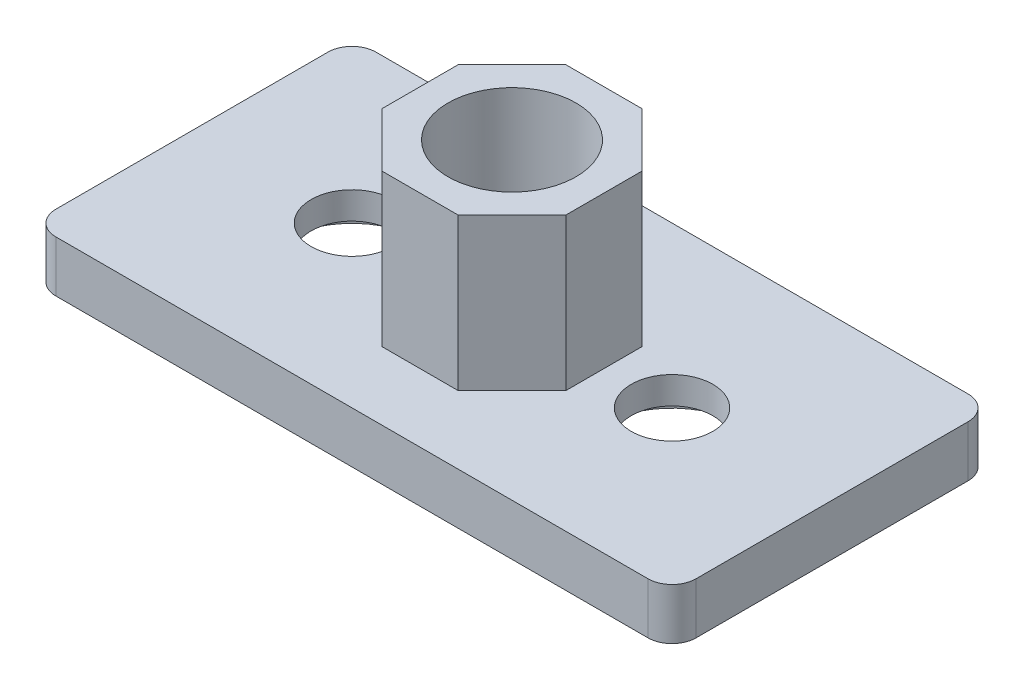
ISO-10303-21;
HEADER;
FILE_DESCRIPTION(('STEP AP214'),'2;1');
FILE_NAME('part.step','',(''),(''),'','','');
FILE_SCHEMA(('AUTOMOTIVE_DESIGN { 1 0 10303 214 1 1 1 1 }'));
ENDSEC;
DATA;
#1=APPLICATION_CONTEXT('core data for automotive mechanical design processes');
#2=APPLICATION_PROTOCOL_DEFINITION('international standard','automotive_design',2000,#1);
#3=PRODUCT_CONTEXT('',#1,'mechanical');
#4=PRODUCT('Part','Part','',(#3));
#5=PRODUCT_RELATED_PRODUCT_CATEGORY('part','',(#4));
#6=PRODUCT_DEFINITION_FORMATION('','',#4);
#7=PRODUCT_DEFINITION_CONTEXT('part definition',#1,'design');
#8=PRODUCT_DEFINITION('design','',#6,#7);
#9=PRODUCT_DEFINITION_SHAPE('','',#8);
#10=(LENGTH_UNIT() NAMED_UNIT(*) SI_UNIT(.MILLI.,.METRE.));
#11=(NAMED_UNIT(*) PLANE_ANGLE_UNIT() SI_UNIT($,.RADIAN.));
#12=(NAMED_UNIT(*) SI_UNIT($,.STERADIAN.) SOLID_ANGLE_UNIT());
#13=UNCERTAINTY_MEASURE_WITH_UNIT(LENGTH_MEASURE(1.E-05),#10,'distance_accuracy_value','');
#14=(GEOMETRIC_REPRESENTATION_CONTEXT(3) GLOBAL_UNCERTAINTY_ASSIGNED_CONTEXT((#13)) GLOBAL_UNIT_ASSIGNED_CONTEXT((#10,
#11,#12)) REPRESENTATION_CONTEXT('',''));
#15=CARTESIAN_POINT('',(0.,0.,0.));
#16=DIRECTION('',(0.,0.,1.));
#17=DIRECTION('',(1.,0.,0.));
#18=AXIS2_PLACEMENT_3D('',#15,#16,#17);
#19=CARTESIAN_POINT('',(0.,1.6,0.));
#20=DIRECTION('',(0.,-1.,0.));
#21=DIRECTION('',(1.,0.,0.));
#22=AXIS2_PLACEMENT_3D('',#19,#20,#21);
#23=PLANE('',#22);
#24=CARTESIAN_POINT('',(-10.,1.6,10.));
#25=DIRECTION('',(0.,-1.,0.));
#26=DIRECTION('',(1.,0.,0.));
#27=AXIS2_PLACEMENT_3D('',#24,#25,#26);
#28=CIRCLE('',#27,2.55000000000001);
#29=CARTESIAN_POINT('',(-7.44999999999999,1.6,10.));
#30=VERTEX_POINT('',#29);
#31=EDGE_CURVE('E205',#30,#30,#28,.T.);
#32=ORIENTED_EDGE('',*,*,#31,.T.);
#33=EDGE_LOOP('',(#32));
#34=FACE_BOUND('',#33,.T.);
#35=CARTESIAN_POINT('',(10.,1.6,10.));
#36=DIRECTION('',(0.,-1.,0.));
#37=DIRECTION('',(1.,0.,0.));
#38=AXIS2_PLACEMENT_3D('',#35,#36,#37);
#39=CIRCLE('',#38,2.55000000000001);
#40=CARTESIAN_POINT('',(12.55,1.6,10.));
#41=VERTEX_POINT('',#40);
#42=EDGE_CURVE('E200',#41,#41,#39,.T.);
#43=ORIENTED_EDGE('',*,*,#42,.T.);
#44=EDGE_LOOP('',(#43));
#45=FACE_BOUND('',#44,.T.);
#46=DIRECTION('',(0.,0.,1.));
#47=VECTOR('',#46,1.);
#48=CARTESIAN_POINT('',(20.,1.6,0.));
#49=LINE('',#48,#47);
#50=CARTESIAN_POINT('',(20.,1.6,1.5));
#51=VERTEX_POINT('',#50);
#52=CARTESIAN_POINT('',(20.,1.6,18.5));
#53=VERTEX_POINT('',#52);
#54=EDGE_CURVE('E187',#51,#53,#49,.T.);
#55=ORIENTED_EDGE('',*,*,#54,.F.);
#56=CARTESIAN_POINT('',(18.5,1.6,1.5));
#57=DIRECTION('',(0.,-1.,0.));
#58=DIRECTION('',(1.,0.,0.));
#59=AXIS2_PLACEMENT_3D('',#56,#57,#58);
#60=CIRCLE('',#59,1.5);
#61=CARTESIAN_POINT('',(18.5,1.6,0.));
#62=VERTEX_POINT('',#61);
#63=EDGE_CURVE('E232',#51,#62,#60,.F.);
#64=ORIENTED_EDGE('',*,*,#63,.T.);
#65=DIRECTION('',(1.,0.,0.));
#66=VECTOR('',#65,1.);
#67=CARTESIAN_POINT('',(-20.,1.6,0.));
#68=LINE('',#67,#66);
#69=CARTESIAN_POINT('',(-18.5,1.6,0.));
#70=VERTEX_POINT('',#69);
#71=EDGE_CURVE('E183',#70,#62,#68,.T.);
#72=ORIENTED_EDGE('',*,*,#71,.F.);
#73=CARTESIAN_POINT('',(-18.5,1.6,1.5));
#74=DIRECTION('',(0.,-1.,0.));
#75=DIRECTION('',(1.,0.,0.));
#76=AXIS2_PLACEMENT_3D('',#73,#74,#75);
#77=CIRCLE('',#76,1.5);
#78=CARTESIAN_POINT('',(-20.,1.6,1.5));
#79=VERTEX_POINT('',#78);
#80=EDGE_CURVE('E230',#70,#79,#77,.F.);
#81=ORIENTED_EDGE('',*,*,#80,.T.);
#82=DIRECTION('',(0.,0.,-1.));
#83=VECTOR('',#82,1.);
#84=CARTESIAN_POINT('',(-20.,1.6,20.));
#85=LINE('',#84,#83);
#86=CARTESIAN_POINT('',(-20.,1.6,18.5));
#87=VERTEX_POINT('',#86);
#88=EDGE_CURVE('E180',#87,#79,#85,.T.);
#89=ORIENTED_EDGE('',*,*,#88,.F.);
#90=CARTESIAN_POINT('',(-18.5,1.6,18.5));
#91=DIRECTION('',(0.,-1.,0.));
#92=DIRECTION('',(1.,0.,0.));
#93=AXIS2_PLACEMENT_3D('',#90,#91,#92);
#94=CIRCLE('',#93,1.5);
#95=CARTESIAN_POINT('',(-18.5,1.6,20.));
#96=VERTEX_POINT('',#95);
#97=EDGE_CURVE('E48',#87,#96,#94,.F.);
#98=ORIENTED_EDGE('',*,*,#97,.T.);
#99=DIRECTION('',(-1.,0.,0.));
#100=VECTOR('',#99,1.);
#101=CARTESIAN_POINT('',(20.,1.6,20.));
#102=LINE('',#101,#100);
#103=CARTESIAN_POINT('',(18.5,1.6,20.));
#104=VERTEX_POINT('',#103);
#105=EDGE_CURVE('E190',#104,#96,#102,.T.);
#106=ORIENTED_EDGE('',*,*,#105,.F.);
#107=CARTESIAN_POINT('',(18.5,1.6,18.5));
#108=DIRECTION('',(0.,-1.,0.));
#109=DIRECTION('',(1.,0.,0.));
#110=AXIS2_PLACEMENT_3D('',#107,#108,#109);
#111=CIRCLE('',#110,1.5);
#112=EDGE_CURVE('E228',#104,#53,#111,.F.);
#113=ORIENTED_EDGE('',*,*,#112,.T.);
#114=EDGE_LOOP('',(#55,#64,#72,#81,#89,#98,#106,#113));
#115=FACE_BOUND('',#114,.T.);
#116=DIRECTION('',(0.,0.,-1.));
#117=VECTOR('',#116,1.);
#118=CARTESIAN_POINT('',(5.75,1.6,7.6182720163547));
#119=LINE('',#118,#117);
#120=CARTESIAN_POINT('',(5.75,1.6,12.3817279836453));
#121=VERTEX_POINT('',#120);
#122=CARTESIAN_POINT('',(5.75,1.6,7.6182720163547));
#123=VERTEX_POINT('',#122);
#124=EDGE_CURVE('E170',#121,#123,#119,.T.);
#125=ORIENTED_EDGE('',*,*,#124,.F.);
#126=DIRECTION('',(0.707106781186547,0.,-0.707106781186548));
#127=VECTOR('',#126,1.);
#128=CARTESIAN_POINT('',(5.75,1.6,12.3817279836453));
#129=LINE('',#128,#127);
#130=CARTESIAN_POINT('',(2.3817279836453,1.6,15.75));
#131=VERTEX_POINT('',#130);
#132=EDGE_CURVE('E167',#131,#121,#129,.T.);
#133=ORIENTED_EDGE('',*,*,#132,.F.);
#134=DIRECTION('',(1.,0.,0.));
#135=VECTOR('',#134,1.);
#136=CARTESIAN_POINT('',(2.38172798364531,1.6,15.75));
#137=LINE('',#136,#135);
#138=CARTESIAN_POINT('',(-2.38172798364529,1.6,15.75));
#139=VERTEX_POINT('',#138);
#140=EDGE_CURVE('E535',#139,#131,#137,.T.);
#141=ORIENTED_EDGE('',*,*,#140,.F.);
#142=DIRECTION('',(0.707106781186548,0.,0.707106781186547));
#143=VECTOR('',#142,1.);
#144=CARTESIAN_POINT('',(-2.38172798364529,1.6,15.75));
#145=LINE('',#144,#143);
#146=CARTESIAN_POINT('',(-5.75,1.6,12.3817279836453));
#147=VERTEX_POINT('',#146);
#148=EDGE_CURVE('E538',#147,#139,#145,.T.);
#149=ORIENTED_EDGE('',*,*,#148,.F.);
#150=DIRECTION('',(0.,0.,1.));
#151=VECTOR('',#150,1.);
#152=CARTESIAN_POINT('',(-5.75,1.6,12.3817279836453));
#153=LINE('',#152,#151);
#154=CARTESIAN_POINT('',(-5.75,1.6,7.61827201635471));
#155=VERTEX_POINT('',#154);
#156=EDGE_CURVE('E541',#155,#147,#153,.T.);
#157=ORIENTED_EDGE('',*,*,#156,.F.);
#158=DIRECTION('',(-0.707106781186547,0.,0.707106781186548));
#159=VECTOR('',#158,1.);
#160=CARTESIAN_POINT('',(-5.75,1.6,7.61827201635471));
#161=LINE('',#160,#159);
#162=CARTESIAN_POINT('',(-2.3817279836453,1.6,4.25));
#163=VERTEX_POINT('',#162);
#164=EDGE_CURVE('E512',#163,#155,#161,.T.);
#165=ORIENTED_EDGE('',*,*,#164,.F.);
#166=DIRECTION('',(-1.,0.,0.));
#167=VECTOR('',#166,1.);
#168=CARTESIAN_POINT('',(-2.3817279836453,1.6,4.25));
#169=LINE('',#168,#167);
#170=CARTESIAN_POINT('',(2.3817279836453,1.6,4.25));
#171=VERTEX_POINT('',#170);
#172=EDGE_CURVE('E509',#171,#163,#169,.T.);
#173=ORIENTED_EDGE('',*,*,#172,.F.);
#174=DIRECTION('',(-0.707106781186547,0.,-0.707106781186548));
#175=VECTOR('',#174,1.);
#176=CARTESIAN_POINT('',(2.3817279836453,1.6,4.25));
#177=LINE('',#176,#175);
#178=EDGE_CURVE('E513',#123,#171,#177,.T.);
#179=ORIENTED_EDGE('',*,*,#178,.F.);
#180=EDGE_LOOP('',(#125,#133,#141,#149,#157,#165,#173,#179));
#181=FACE_BOUND('',#180,.T.);
#182=ADVANCED_FACE('F33',(#34,#45,#115,#181),#23,.F.);
#183=CARTESIAN_POINT('',(-20.,1.6,20.));
#184=DIRECTION('',(-1.,0.,0.));
#185=DIRECTION('',(0.,-1.,0.));
#186=AXIS2_PLACEMENT_3D('',#183,#184,#185);
#187=PLANE('',#186);
#188=ORIENTED_EDGE('',*,*,#88,.T.);
#189=DIRECTION('',(0.,-1.,0.));
#190=VECTOR('',#189,1.);
#191=CARTESIAN_POINT('',(-20.,1.6,1.5));
#192=LINE('',#191,#190);
#193=CARTESIAN_POINT('',(-20.,-1.6,1.5));
#194=VERTEX_POINT('',#193);
#195=EDGE_CURVE('E236',#79,#194,#192,.T.);
#196=ORIENTED_EDGE('',*,*,#195,.T.);
#197=DIRECTION('',(0.,0.,-1.));
#198=VECTOR('',#197,1.);
#199=CARTESIAN_POINT('',(-20.,-1.6,20.));
#200=LINE('',#199,#198);
#201=CARTESIAN_POINT('',(-20.,-1.6,18.5));
#202=VERTEX_POINT('',#201);
#203=EDGE_CURVE('E171',#202,#194,#200,.T.);
#204=ORIENTED_EDGE('',*,*,#203,.F.);
#205=DIRECTION('',(0.,-1.,0.));
#206=VECTOR('',#205,1.);
#207=CARTESIAN_POINT('',(-20.,1.6,18.5));
#208=LINE('',#207,#206);
#209=EDGE_CURVE('E234',#202,#87,#208,.F.);
#210=ORIENTED_EDGE('',*,*,#209,.T.);
#211=EDGE_LOOP('',(#188,#196,#204,#210));
#212=FACE_BOUND('',#211,.T.);
#213=ADVANCED_FACE('F269',(#212),#187,.T.);
#214=CARTESIAN_POINT('',(20.,1.6,20.));
#215=DIRECTION('',(0.,0.,1.));
#216=DIRECTION('',(1.,0.,0.));
#217=AXIS2_PLACEMENT_3D('',#214,#215,#216);
#218=PLANE('',#217);
#219=DIRECTION('',(-1.,0.,0.));
#220=VECTOR('',#219,1.);
#221=CARTESIAN_POINT('',(20.,-1.6,20.));
#222=LINE('',#221,#220);
#223=CARTESIAN_POINT('',(18.5,-1.6,20.));
#224=VERTEX_POINT('',#223);
#225=CARTESIAN_POINT('',(-18.5,-1.6,20.));
#226=VERTEX_POINT('',#225);
#227=EDGE_CURVE('E184',#224,#226,#222,.T.);
#228=ORIENTED_EDGE('',*,*,#227,.F.);
#229=DIRECTION('',(0.,-1.,0.));
#230=VECTOR('',#229,1.);
#231=CARTESIAN_POINT('',(18.5,1.6,20.));
#232=LINE('',#231,#230);
#233=EDGE_CURVE('E11',#224,#104,#232,.F.);
#234=ORIENTED_EDGE('',*,*,#233,.T.);
#235=ORIENTED_EDGE('',*,*,#105,.T.);
#236=DIRECTION('',(0.,-1.,0.));
#237=VECTOR('',#236,1.);
#238=CARTESIAN_POINT('',(-18.5,1.6,20.));
#239=LINE('',#238,#237);
#240=EDGE_CURVE('E41',#96,#226,#239,.T.);
#241=ORIENTED_EDGE('',*,*,#240,.T.);
#242=EDGE_LOOP('',(#228,#234,#235,#241));
#243=FACE_BOUND('',#242,.T.);
#244=ADVANCED_FACE('F240',(#243),#218,.T.);
#245=CARTESIAN_POINT('',(20.,1.6,0.));
#246=DIRECTION('',(1.,0.,0.));
#247=DIRECTION('',(0.,1.,0.));
#248=AXIS2_PLACEMENT_3D('',#245,#246,#247);
#249=PLANE('',#248);
#250=DIRECTION('',(0.,0.,1.));
#251=VECTOR('',#250,1.);
#252=CARTESIAN_POINT('',(20.,-1.6,0.));
#253=LINE('',#252,#251);
#254=CARTESIAN_POINT('',(20.,-1.6,1.5));
#255=VERTEX_POINT('',#254);
#256=CARTESIAN_POINT('',(20.,-1.6,18.5));
#257=VERTEX_POINT('',#256);
#258=EDGE_CURVE('E195',#255,#257,#253,.T.);
#259=ORIENTED_EDGE('',*,*,#258,.F.);
#260=DIRECTION('',(0.,-1.,0.));
#261=VECTOR('',#260,1.);
#262=CARTESIAN_POINT('',(20.,1.6,1.5));
#263=LINE('',#262,#261);
#264=EDGE_CURVE('E225',#255,#51,#263,.F.);
#265=ORIENTED_EDGE('',*,*,#264,.T.);
#266=ORIENTED_EDGE('',*,*,#54,.T.);
#267=DIRECTION('',(0.,-1.,0.));
#268=VECTOR('',#267,1.);
#269=CARTESIAN_POINT('',(20.,1.6,18.5));
#270=LINE('',#269,#268);
#271=EDGE_CURVE('E222',#53,#257,#270,.T.);
#272=ORIENTED_EDGE('',*,*,#271,.T.);
#273=EDGE_LOOP('',(#259,#265,#266,#272));
#274=FACE_BOUND('',#273,.T.);
#275=ADVANCED_FACE('F251',(#274),#249,.T.);
#276=CARTESIAN_POINT('',(-20.,1.6,0.));
#277=DIRECTION('',(0.,0.,-1.));
#278=DIRECTION('',(-1.,0.,0.));
#279=AXIS2_PLACEMENT_3D('',#276,#277,#278);
#280=PLANE('',#279);
#281=ORIENTED_EDGE('',*,*,#71,.T.);
#282=DIRECTION('',(0.,-1.,0.));
#283=VECTOR('',#282,1.);
#284=CARTESIAN_POINT('',(18.5,1.6,0.));
#285=LINE('',#284,#283);
#286=CARTESIAN_POINT('',(18.5,-1.6,0.));
#287=VERTEX_POINT('',#286);
#288=EDGE_CURVE('E211',#62,#287,#285,.T.);
#289=ORIENTED_EDGE('',*,*,#288,.T.);
#290=DIRECTION('',(1.,0.,0.));
#291=VECTOR('',#290,1.);
#292=CARTESIAN_POINT('',(-20.,-1.6,0.));
#293=LINE('',#292,#291);
#294=CARTESIAN_POINT('',(-18.5,-1.6,0.));
#295=VERTEX_POINT('',#294);
#296=EDGE_CURVE('E174',#295,#287,#293,.T.);
#297=ORIENTED_EDGE('',*,*,#296,.F.);
#298=DIRECTION('',(0.,-1.,0.));
#299=VECTOR('',#298,1.);
#300=CARTESIAN_POINT('',(-18.5,1.6,0.));
#301=LINE('',#300,#299);
#302=EDGE_CURVE('E191',#295,#70,#301,.F.);
#303=ORIENTED_EDGE('',*,*,#302,.T.);
#304=EDGE_LOOP('',(#281,#289,#297,#303));
#305=FACE_BOUND('',#304,.T.);
#306=ADVANCED_FACE('F262',(#305),#280,.T.);
#307=CARTESIAN_POINT('',(0.,-1.6,0.));
#308=DIRECTION('',(0.,-1.,0.));
#309=DIRECTION('',(1.,0.,0.));
#310=AXIS2_PLACEMENT_3D('',#307,#308,#309);
#311=PLANE('',#310);
#312=CARTESIAN_POINT('',(-10.,-1.6,10.));
#313=DIRECTION('',(0.,-1.,0.));
#314=DIRECTION('',(0.,0.,-1.));
#315=AXIS2_PLACEMENT_3D('',#312,#313,#314);
#316=CIRCLE('',#315,4.50000000000001);
#317=CARTESIAN_POINT('',(-10.,-1.6,5.49999999999999));
#318=VERTEX_POINT('',#317);
#319=EDGE_CURVE('E573',#318,#318,#316,.T.);
#320=ORIENTED_EDGE('',*,*,#319,.F.);
#321=EDGE_LOOP('',(#320));
#322=FACE_BOUND('',#321,.T.);
#323=CARTESIAN_POINT('',(10.,-1.6,10.));
#324=DIRECTION('',(0.,-1.,0.));
#325=DIRECTION('',(0.,0.,-1.));
#326=AXIS2_PLACEMENT_3D('',#323,#324,#325);
#327=CIRCLE('',#326,4.50000000000001);
#328=CARTESIAN_POINT('',(10.,-1.6,5.49999999999999));
#329=VERTEX_POINT('',#328);
#330=EDGE_CURVE('E208',#329,#329,#327,.T.);
#331=ORIENTED_EDGE('',*,*,#330,.F.);
#332=EDGE_LOOP('',(#331));
#333=FACE_BOUND('',#332,.T.);
#334=CARTESIAN_POINT('',(0.,-1.6,10.));
#335=DIRECTION('',(0.,-1.,0.));
#336=DIRECTION('',(0.,0.,-1.));
#337=AXIS2_PLACEMENT_3D('',#334,#335,#336);
#338=CIRCLE('',#337,3.99999999999999);
#339=CARTESIAN_POINT('',(0.,-1.6,6.00000000000001));
#340=VERTEX_POINT('',#339);
#341=EDGE_CURVE('E203',#340,#340,#338,.T.);
#342=ORIENTED_EDGE('',*,*,#341,.F.);
#343=EDGE_LOOP('',(#342));
#344=FACE_BOUND('',#343,.T.);
#345=ORIENTED_EDGE('',*,*,#296,.T.);
#346=CARTESIAN_POINT('',(18.5,-1.6,1.5));
#347=DIRECTION('',(0.,-1.,0.));
#348=DIRECTION('',(1.,0.,0.));
#349=AXIS2_PLACEMENT_3D('',#346,#347,#348);
#350=CIRCLE('',#349,1.5);
#351=EDGE_CURVE('E220',#287,#255,#350,.T.);
#352=ORIENTED_EDGE('',*,*,#351,.T.);
#353=ORIENTED_EDGE('',*,*,#258,.T.);
#354=CARTESIAN_POINT('',(18.5,-1.6,18.5));
#355=DIRECTION('',(0.,-1.,0.));
#356=DIRECTION('',(1.,0.,0.));
#357=AXIS2_PLACEMENT_3D('',#354,#355,#356);
#358=CIRCLE('',#357,1.5);
#359=EDGE_CURVE('E216',#257,#224,#358,.T.);
#360=ORIENTED_EDGE('',*,*,#359,.T.);
#361=ORIENTED_EDGE('',*,*,#227,.T.);
#362=CARTESIAN_POINT('',(-18.5,-1.6,18.5));
#363=DIRECTION('',(0.,-1.,0.));
#364=DIRECTION('',(1.,0.,0.));
#365=AXIS2_PLACEMENT_3D('',#362,#363,#364);
#366=CIRCLE('',#365,1.5);
#367=EDGE_CURVE('E214',#226,#202,#366,.T.);
#368=ORIENTED_EDGE('',*,*,#367,.T.);
#369=ORIENTED_EDGE('',*,*,#203,.T.);
#370=CARTESIAN_POINT('',(-18.5,-1.6,1.5));
#371=DIRECTION('',(0.,-1.,0.));
#372=DIRECTION('',(1.,0.,0.));
#373=AXIS2_PLACEMENT_3D('',#370,#371,#372);
#374=CIRCLE('',#373,1.5);
#375=EDGE_CURVE('E218',#194,#295,#374,.T.);
#376=ORIENTED_EDGE('',*,*,#375,.T.);
#377=EDGE_LOOP('',(#345,#352,#353,#360,#361,#368,#369,#376));
#378=FACE_BOUND('',#377,.T.);
#379=ADVANCED_FACE('F243',(#322,#333,#344,#378),#311,.T.);
#380=CARTESIAN_POINT('',(5.75,11.1,7.6182720163547));
#381=DIRECTION('',(-1.,0.,0.));
#382=DIRECTION('',(0.,-1.,0.));
#383=AXIS2_PLACEMENT_3D('',#380,#381,#382);
#384=PLANE('',#383);
#385=ORIENTED_EDGE('',*,*,#124,.T.);
#386=DIRECTION('',(0.,-1.,0.));
#387=VECTOR('',#386,1.);
#388=CARTESIAN_POINT('',(5.75,11.1,7.6182720163547));
#389=LINE('',#388,#387);
#390=CARTESIAN_POINT('',(5.75,11.1,7.6182720163547));
#391=VERTEX_POINT('',#390);
#392=EDGE_CURVE('E151',#391,#123,#389,.T.);
#393=ORIENTED_EDGE('',*,*,#392,.F.);
#394=DIRECTION('',(0.,0.,-1.));
#395=VECTOR('',#394,1.);
#396=CARTESIAN_POINT('',(5.75,11.1,7.6182720163547));
#397=LINE('',#396,#395);
#398=CARTESIAN_POINT('',(5.75,11.1,12.3817279836453));
#399=VERTEX_POINT('',#398);
#400=EDGE_CURVE('E158',#399,#391,#397,.T.);
#401=ORIENTED_EDGE('',*,*,#400,.F.);
#402=DIRECTION('',(0.,-1.,0.));
#403=VECTOR('',#402,1.);
#404=CARTESIAN_POINT('',(5.75,11.1,12.3817279836453));
#405=LINE('',#404,#403);
#406=EDGE_CURVE('E531',#399,#121,#405,.T.);
#407=ORIENTED_EDGE('',*,*,#406,.T.);
#408=EDGE_LOOP('',(#385,#393,#401,#407));
#409=FACE_BOUND('',#408,.T.);
#410=ADVANCED_FACE('F169',(#409),#384,.F.);
#411=CARTESIAN_POINT('',(2.3817279836453,11.1,4.25));
#412=DIRECTION('',(-0.707106781186548,0.,0.707106781186547));
#413=DIRECTION('',(0.707106781186547,0.,0.707106781186548));
#414=AXIS2_PLACEMENT_3D('',#411,#412,#413);
#415=PLANE('',#414);
#416=ORIENTED_EDGE('',*,*,#178,.T.);
#417=DIRECTION('',(0.,-1.,0.));
#418=VECTOR('',#417,1.);
#419=CARTESIAN_POINT('',(2.3817279836453,11.1,4.25));
#420=LINE('',#419,#418);
#421=CARTESIAN_POINT('',(2.3817279836453,11.1,4.25));
#422=VERTEX_POINT('',#421);
#423=EDGE_CURVE('E154',#422,#171,#420,.T.);
#424=ORIENTED_EDGE('',*,*,#423,.F.);
#425=DIRECTION('',(-0.707106781186547,0.,-0.707106781186548));
#426=VECTOR('',#425,1.);
#427=CARTESIAN_POINT('',(2.3817279836453,11.1,4.25));
#428=LINE('',#427,#426);
#429=EDGE_CURVE('E146',#391,#422,#428,.T.);
#430=ORIENTED_EDGE('',*,*,#429,.F.);
#431=ORIENTED_EDGE('',*,*,#392,.T.);
#432=EDGE_LOOP('',(#416,#424,#430,#431));
#433=FACE_BOUND('',#432,.T.);
#434=ADVANCED_FACE('F149',(#433),#415,.F.);
#435=CARTESIAN_POINT('',(-2.3817279836453,11.1,4.25));
#436=DIRECTION('',(0.,0.,1.));
#437=DIRECTION('',(1.,0.,0.));
#438=AXIS2_PLACEMENT_3D('',#435,#436,#437);
#439=PLANE('',#438);
#440=ORIENTED_EDGE('',*,*,#172,.T.);
#441=DIRECTION('',(0.,-1.,0.));
#442=VECTOR('',#441,1.);
#443=CARTESIAN_POINT('',(-2.3817279836453,11.1,4.25));
#444=LINE('',#443,#442);
#445=CARTESIAN_POINT('',(-2.3817279836453,11.1,4.25));
#446=VERTEX_POINT('',#445);
#447=EDGE_CURVE('E176',#446,#163,#444,.T.);
#448=ORIENTED_EDGE('',*,*,#447,.F.);
#449=DIRECTION('',(-1.,0.,0.));
#450=VECTOR('',#449,1.);
#451=CARTESIAN_POINT('',(-2.3817279836453,11.1,4.25));
#452=LINE('',#451,#450);
#453=EDGE_CURVE('E157',#422,#446,#452,.T.);
#454=ORIENTED_EDGE('',*,*,#453,.F.);
#455=ORIENTED_EDGE('',*,*,#423,.T.);
#456=EDGE_LOOP('',(#440,#448,#454,#455));
#457=FACE_BOUND('',#456,.T.);
#458=ADVANCED_FACE('F435',(#457),#439,.F.);
#459=CARTESIAN_POINT('',(-5.75,11.1,7.61827201635471));
#460=DIRECTION('',(0.707106781186548,0.,0.707106781186547));
#461=DIRECTION('',(0.707106781186547,0.,-0.707106781186548));
#462=AXIS2_PLACEMENT_3D('',#459,#460,#461);
#463=PLANE('',#462);
#464=ORIENTED_EDGE('',*,*,#164,.T.);
#465=DIRECTION('',(0.,-1.,0.));
#466=VECTOR('',#465,1.);
#467=CARTESIAN_POINT('',(-5.75,11.1,7.61827201635471));
#468=LINE('',#467,#466);
#469=CARTESIAN_POINT('',(-5.75,11.1,7.61827201635471));
#470=VERTEX_POINT('',#469);
#471=EDGE_CURVE('E519',#470,#155,#468,.T.);
#472=ORIENTED_EDGE('',*,*,#471,.F.);
#473=DIRECTION('',(-0.707106781186547,0.,0.707106781186548));
#474=VECTOR('',#473,1.);
#475=CARTESIAN_POINT('',(-5.75,11.1,7.61827201635471));
#476=LINE('',#475,#474);
#477=EDGE_CURVE('E518',#446,#470,#476,.T.);
#478=ORIENTED_EDGE('',*,*,#477,.F.);
#479=ORIENTED_EDGE('',*,*,#447,.T.);
#480=EDGE_LOOP('',(#464,#472,#478,#479));
#481=FACE_BOUND('',#480,.T.);
#482=ADVANCED_FACE('F426',(#481),#463,.F.);
#483=CARTESIAN_POINT('',(-5.75,11.1,12.3817279836453));
#484=DIRECTION('',(1.,0.,0.));
#485=DIRECTION('',(0.,0.,-1.));
#486=AXIS2_PLACEMENT_3D('',#483,#484,#485);
#487=PLANE('',#486);
#488=ORIENTED_EDGE('',*,*,#156,.T.);
#489=DIRECTION('',(0.,-1.,0.));
#490=VECTOR('',#489,1.);
#491=CARTESIAN_POINT('',(-5.75,11.1,12.3817279836453));
#492=LINE('',#491,#490);
#493=CARTESIAN_POINT('',(-5.75,11.1,12.3817279836453));
#494=VERTEX_POINT('',#493);
#495=EDGE_CURVE('E520',#494,#147,#492,.T.);
#496=ORIENTED_EDGE('',*,*,#495,.F.);
#497=DIRECTION('',(0.,0.,1.));
#498=VECTOR('',#497,1.);
#499=CARTESIAN_POINT('',(-5.75,11.1,12.3817279836453));
#500=LINE('',#499,#498);
#501=EDGE_CURVE('E553',#470,#494,#500,.T.);
#502=ORIENTED_EDGE('',*,*,#501,.F.);
#503=ORIENTED_EDGE('',*,*,#471,.T.);
#504=EDGE_LOOP('',(#488,#496,#502,#503));
#505=FACE_BOUND('',#504,.T.);
#506=ADVANCED_FACE('F417',(#505),#487,.F.);
#507=CARTESIAN_POINT('',(-2.38172798364529,11.1,15.75));
#508=DIRECTION('',(0.707106781186547,0.,-0.707106781186548));
#509=DIRECTION('',(-0.707106781186548,0.,-0.707106781186547));
#510=AXIS2_PLACEMENT_3D('',#507,#508,#509);
#511=PLANE('',#510);
#512=ORIENTED_EDGE('',*,*,#148,.T.);
#513=DIRECTION('',(0.,-1.,0.));
#514=VECTOR('',#513,1.);
#515=CARTESIAN_POINT('',(-2.38172798364529,11.1,15.75));
#516=LINE('',#515,#514);
#517=CARTESIAN_POINT('',(-2.38172798364529,11.1,15.75));
#518=VERTEX_POINT('',#517);
#519=EDGE_CURVE('E525',#518,#139,#516,.T.);
#520=ORIENTED_EDGE('',*,*,#519,.F.);
#521=DIRECTION('',(0.707106781186548,0.,0.707106781186547));
#522=VECTOR('',#521,1.);
#523=CARTESIAN_POINT('',(-2.38172798364529,11.1,15.75));
#524=LINE('',#523,#522);
#525=EDGE_CURVE('E551',#494,#518,#524,.T.);
#526=ORIENTED_EDGE('',*,*,#525,.F.);
#527=ORIENTED_EDGE('',*,*,#495,.T.);
#528=EDGE_LOOP('',(#512,#520,#526,#527));
#529=FACE_BOUND('',#528,.T.);
#530=ADVANCED_FACE('F408',(#529),#511,.F.);
#531=CARTESIAN_POINT('',(2.3817279836453,11.1,15.75));
#532=DIRECTION('',(0.,0.,-1.));
#533=DIRECTION('',(-1.,0.,0.));
#534=AXIS2_PLACEMENT_3D('',#531,#532,#533);
#535=PLANE('',#534);
#536=ORIENTED_EDGE('',*,*,#140,.T.);
#537=DIRECTION('',(0.,-1.,0.));
#538=VECTOR('',#537,1.);
#539=CARTESIAN_POINT('',(2.3817279836453,11.1,15.75));
#540=LINE('',#539,#538);
#541=CARTESIAN_POINT('',(2.3817279836453,11.1,15.75));
#542=VERTEX_POINT('',#541);
#543=EDGE_CURVE('E528',#542,#131,#540,.T.);
#544=ORIENTED_EDGE('',*,*,#543,.F.);
#545=DIRECTION('',(1.,0.,0.));
#546=VECTOR('',#545,1.);
#547=CARTESIAN_POINT('',(2.3817279836453,11.1,15.75));
#548=LINE('',#547,#546);
#549=EDGE_CURVE('E549',#518,#542,#548,.T.);
#550=ORIENTED_EDGE('',*,*,#549,.F.);
#551=ORIENTED_EDGE('',*,*,#519,.T.);
#552=EDGE_LOOP('',(#536,#544,#550,#551));
#553=FACE_BOUND('',#552,.T.);
#554=ADVANCED_FACE('F399',(#553),#535,.F.);
#555=CARTESIAN_POINT('',(5.75,11.1,12.3817279836453));
#556=DIRECTION('',(-0.707106781186548,0.,-0.707106781186547));
#557=DIRECTION('',(-0.707106781186547,0.,0.707106781186548));
#558=AXIS2_PLACEMENT_3D('',#555,#556,#557);
#559=PLANE('',#558);
#560=ORIENTED_EDGE('',*,*,#132,.T.);
#561=ORIENTED_EDGE('',*,*,#406,.F.);
#562=DIRECTION('',(0.707106781186547,0.,-0.707106781186548));
#563=VECTOR('',#562,1.);
#564=CARTESIAN_POINT('',(5.75,11.1,12.3817279836453));
#565=LINE('',#564,#563);
#566=EDGE_CURVE('E163',#542,#399,#565,.T.);
#567=ORIENTED_EDGE('',*,*,#566,.F.);
#568=ORIENTED_EDGE('',*,*,#543,.T.);
#569=EDGE_LOOP('',(#560,#561,#567,#568));
#570=FACE_BOUND('',#569,.T.);
#571=ADVANCED_FACE('F390',(#570),#559,.F.);
#572=CARTESIAN_POINT('',(0.,11.1,0.));
#573=DIRECTION('',(0.,-1.,0.));
#574=DIRECTION('',(1.,0.,0.));
#575=AXIS2_PLACEMENT_3D('',#572,#573,#574);
#576=PLANE('',#575);
#577=CARTESIAN_POINT('',(0.,11.1,10.));
#578=DIRECTION('',(0.,-1.,0.));
#579=DIRECTION('',(0.,0.,-1.));
#580=AXIS2_PLACEMENT_3D('',#577,#578,#579);
#581=CIRCLE('',#580,3.99999999999999);
#582=CARTESIAN_POINT('',(0.,11.1,6.00000000000002));
#583=VERTEX_POINT('',#582);
#584=EDGE_CURVE('E547',#583,#583,#581,.T.);
#585=ORIENTED_EDGE('',*,*,#584,.T.);
#586=EDGE_LOOP('',(#585));
#587=FACE_BOUND('',#586,.T.);
#588=ORIENTED_EDGE('',*,*,#400,.T.);
#589=ORIENTED_EDGE('',*,*,#429,.T.);
#590=ORIENTED_EDGE('',*,*,#453,.T.);
#591=ORIENTED_EDGE('',*,*,#477,.T.);
#592=ORIENTED_EDGE('',*,*,#501,.T.);
#593=ORIENTED_EDGE('',*,*,#525,.T.);
#594=ORIENTED_EDGE('',*,*,#549,.T.);
#595=ORIENTED_EDGE('',*,*,#566,.T.);
#596=EDGE_LOOP('',(#588,#589,#590,#591,#592,#593,#594,#595));
#597=FACE_BOUND('',#596,.T.);
#598=ADVANCED_FACE('F161',(#587,#597),#576,.F.);
#599=CARTESIAN_POINT('',(0.,-1.6,10.));
#600=DIRECTION('',(0.,-1.,0.));
#601=DIRECTION('',(0.,0.,-1.));
#602=AXIS2_PLACEMENT_3D('',#599,#600,#601);
#603=CYLINDRICAL_SURFACE('',#602,3.99999999999999);
#604=ORIENTED_EDGE('',*,*,#584,.F.);
#605=EDGE_LOOP('',(#604));
#606=FACE_BOUND('',#605,.T.);
#607=ORIENTED_EDGE('',*,*,#341,.T.);
#608=EDGE_LOOP('',(#607));
#609=FACE_BOUND('',#608,.T.);
#610=ADVANCED_FACE('F373',(#606,#609),#603,.F.);
#611=CARTESIAN_POINT('',(10.,-1.6,10.));
#612=DIRECTION('',(0.,-1.,0.));
#613=DIRECTION('',(0.,0.,-1.));
#614=AXIS2_PLACEMENT_3D('',#611,#612,#613);
#615=CYLINDRICAL_SURFACE('',#614,2.55000000000001);
#616=CARTESIAN_POINT('',(10.,-0.0999999999999977,10.));
#617=DIRECTION('',(0.,-1.,0.));
#618=DIRECTION('',(0.,0.,-1.));
#619=AXIS2_PLACEMENT_3D('',#616,#617,#618);
#620=CIRCLE('',#619,2.55000000000001);
#621=CARTESIAN_POINT('',(10.,-0.0999999999999977,7.44999999999999));
#622=VERTEX_POINT('',#621);
#623=EDGE_CURVE('E204',#622,#622,#620,.T.);
#624=ORIENTED_EDGE('',*,*,#623,.T.);
#625=EDGE_LOOP('',(#624));
#626=FACE_BOUND('',#625,.T.);
#627=ORIENTED_EDGE('',*,*,#42,.F.);
#628=EDGE_LOOP('',(#627));
#629=FACE_BOUND('',#628,.T.);
#630=ADVANCED_FACE('F364',(#626,#629),#615,.F.);
#631=CARTESIAN_POINT('',(12.55,-0.0999999999999994,10.));
#632=DIRECTION('',(0.,1.,0.));
#633=DIRECTION('',(0.,0.,1.));
#634=AXIS2_PLACEMENT_3D('',#631,#632,#633);
#635=PLANE('',#634);
#636=ORIENTED_EDGE('',*,*,#623,.F.);
#637=EDGE_LOOP('',(#636));
#638=FACE_BOUND('',#637,.T.);
#639=CARTESIAN_POINT('',(10.,-0.100000000000001,10.));
#640=DIRECTION('',(0.,-1.,0.));
#641=DIRECTION('',(0.,0.,-1.));
#642=AXIS2_PLACEMENT_3D('',#639,#640,#641);
#643=CIRCLE('',#642,4.50000000000001);
#644=CARTESIAN_POINT('',(10.,-0.100000000000001,5.49999999999999));
#645=VERTEX_POINT('',#644);
#646=EDGE_CURVE('E563',#645,#645,#643,.T.);
#647=ORIENTED_EDGE('',*,*,#646,.T.);
#648=EDGE_LOOP('',(#647));
#649=FACE_BOUND('',#648,.T.);
#650=ADVANCED_FACE('F355',(#638,#649),#635,.F.);
#651=CARTESIAN_POINT('',(10.,-1.6,10.));
#652=DIRECTION('',(0.,-1.,0.));
#653=DIRECTION('',(0.,0.,-1.));
#654=AXIS2_PLACEMENT_3D('',#651,#652,#653);
#655=CYLINDRICAL_SURFACE('',#654,4.50000000000001);
#656=ORIENTED_EDGE('',*,*,#646,.F.);
#657=EDGE_LOOP('',(#656));
#658=FACE_BOUND('',#657,.T.);
#659=ORIENTED_EDGE('',*,*,#330,.T.);
#660=EDGE_LOOP('',(#659));
#661=FACE_BOUND('',#660,.T.);
#662=ADVANCED_FACE('F346',(#658,#661),#655,.F.);
#663=CARTESIAN_POINT('',(-10.,-1.6,10.));
#664=DIRECTION('',(0.,-1.,0.));
#665=DIRECTION('',(0.,0.,-1.));
#666=AXIS2_PLACEMENT_3D('',#663,#664,#665);
#667=CYLINDRICAL_SURFACE('',#666,2.55000000000001);
#668=CARTESIAN_POINT('',(-10.,-0.1,10.));
#669=DIRECTION('',(0.,-1.,0.));
#670=DIRECTION('',(0.,0.,-1.));
#671=AXIS2_PLACEMENT_3D('',#668,#669,#670);
#672=CIRCLE('',#671,2.55000000000001);
#673=CARTESIAN_POINT('',(-10.,-0.1,7.44999999999999));
#674=VERTEX_POINT('',#673);
#675=EDGE_CURVE('E209',#674,#674,#672,.T.);
#676=ORIENTED_EDGE('',*,*,#675,.T.);
#677=EDGE_LOOP('',(#676));
#678=FACE_BOUND('',#677,.T.);
#679=ORIENTED_EDGE('',*,*,#31,.F.);
#680=EDGE_LOOP('',(#679));
#681=FACE_BOUND('',#680,.T.);
#682=ADVANCED_FACE('F337',(#678,#681),#667,.F.);
#683=CARTESIAN_POINT('',(-7.44999999999999,-0.100000000000002,10.));
#684=DIRECTION('',(0.,1.,0.));
#685=DIRECTION('',(0.,0.,1.));
#686=AXIS2_PLACEMENT_3D('',#683,#684,#685);
#687=PLANE('',#686);
#688=ORIENTED_EDGE('',*,*,#675,.F.);
#689=EDGE_LOOP('',(#688));
#690=FACE_BOUND('',#689,.T.);
#691=CARTESIAN_POINT('',(-10.,-0.100000000000004,10.));
#692=DIRECTION('',(0.,-1.,0.));
#693=DIRECTION('',(0.,0.,-1.));
#694=AXIS2_PLACEMENT_3D('',#691,#692,#693);
#695=CIRCLE('',#694,4.50000000000001);
#696=CARTESIAN_POINT('',(-10.,-0.100000000000004,5.49999999999999));
#697=VERTEX_POINT('',#696);
#698=EDGE_CURVE('E570',#697,#697,#695,.T.);
#699=ORIENTED_EDGE('',*,*,#698,.T.);
#700=EDGE_LOOP('',(#699));
#701=FACE_BOUND('',#700,.T.);
#702=ADVANCED_FACE('F328',(#690,#701),#687,.F.);
#703=CARTESIAN_POINT('',(-10.,-1.6,10.));
#704=DIRECTION('',(0.,-1.,0.));
#705=DIRECTION('',(0.,0.,-1.));
#706=AXIS2_PLACEMENT_3D('',#703,#704,#705);
#707=CYLINDRICAL_SURFACE('',#706,4.50000000000001);
#708=ORIENTED_EDGE('',*,*,#698,.F.);
#709=EDGE_LOOP('',(#708));
#710=FACE_BOUND('',#709,.T.);
#711=ORIENTED_EDGE('',*,*,#319,.T.);
#712=EDGE_LOOP('',(#711));
#713=FACE_BOUND('',#712,.T.);
#714=ADVANCED_FACE('F297',(#710,#713),#707,.F.);
#715=CARTESIAN_POINT('',(18.5,1.6,1.5));
#716=DIRECTION('',(0.,-1.,0.));
#717=DIRECTION('',(1.,0.,0.));
#718=AXIS2_PLACEMENT_3D('',#715,#716,#717);
#719=CYLINDRICAL_SURFACE('',#718,1.5);
#720=ORIENTED_EDGE('',*,*,#63,.F.);
#721=ORIENTED_EDGE('',*,*,#264,.F.);
#722=ORIENTED_EDGE('',*,*,#351,.F.);
#723=ORIENTED_EDGE('',*,*,#288,.F.);
#724=EDGE_LOOP('',(#720,#721,#722,#723));
#725=FACE_BOUND('',#724,.T.);
#726=ADVANCED_FACE('F259',(#725),#719,.T.);
#727=CARTESIAN_POINT('',(-18.5,1.6,1.5));
#728=DIRECTION('',(0.,-1.,0.));
#729=DIRECTION('',(1.,0.,0.));
#730=AXIS2_PLACEMENT_3D('',#727,#728,#729);
#731=CYLINDRICAL_SURFACE('',#730,1.5);
#732=ORIENTED_EDGE('',*,*,#80,.F.);
#733=ORIENTED_EDGE('',*,*,#302,.F.);
#734=ORIENTED_EDGE('',*,*,#375,.F.);
#735=ORIENTED_EDGE('',*,*,#195,.F.);
#736=EDGE_LOOP('',(#732,#733,#734,#735));
#737=FACE_BOUND('',#736,.T.);
#738=ADVANCED_FACE('F267',(#737),#731,.T.);
#739=CARTESIAN_POINT('',(18.5,1.6,18.5));
#740=DIRECTION('',(0.,-1.,0.));
#741=DIRECTION('',(1.,0.,0.));
#742=AXIS2_PLACEMENT_3D('',#739,#740,#741);
#743=CYLINDRICAL_SURFACE('',#742,1.5);
#744=ORIENTED_EDGE('',*,*,#112,.F.);
#745=ORIENTED_EDGE('',*,*,#233,.F.);
#746=ORIENTED_EDGE('',*,*,#359,.F.);
#747=ORIENTED_EDGE('',*,*,#271,.F.);
#748=EDGE_LOOP('',(#744,#745,#746,#747));
#749=FACE_BOUND('',#748,.T.);
#750=ADVANCED_FACE('F249',(#749),#743,.T.);
#751=CARTESIAN_POINT('',(-18.5,1.6,18.5));
#752=DIRECTION('',(0.,-1.,0.));
#753=DIRECTION('',(1.,0.,0.));
#754=AXIS2_PLACEMENT_3D('',#751,#752,#753);
#755=CYLINDRICAL_SURFACE('',#754,1.5);
#756=ORIENTED_EDGE('',*,*,#97,.F.);
#757=ORIENTED_EDGE('',*,*,#209,.F.);
#758=ORIENTED_EDGE('',*,*,#367,.F.);
#759=ORIENTED_EDGE('',*,*,#240,.F.);
#760=EDGE_LOOP('',(#756,#757,#758,#759));
#761=FACE_BOUND('',#760,.T.);
#762=ADVANCED_FACE('F35',(#761),#755,.T.);
#763=CLOSED_SHELL('',(#182,#213,#244,#275,#306,#379,#410,#434,#458,#482,#506,#530,#554,#571,
#598,#610,#630,#650,#662,#682,#702,#714,#726,#738,#750,#762));
#764=MANIFOLD_SOLID_BREP('B2',#763);
#765=ADVANCED_BREP_SHAPE_REPRESENTATION('',(#18,#764),#14);
#766=SHAPE_DEFINITION_REPRESENTATION(#9,#765);
ENDSEC;
END-ISO-10303-21;
